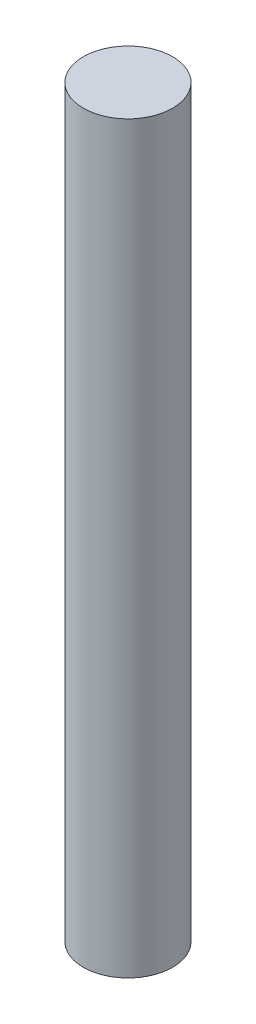
ISO-10303-21;
HEADER;
FILE_DESCRIPTION(('STEP AP214'),'2;1');
FILE_NAME('part.step','',(''),(''),'','','');
FILE_SCHEMA(('AUTOMOTIVE_DESIGN { 1 0 10303 214 1 1 1 1 }'));
ENDSEC;
DATA;
#1=APPLICATION_CONTEXT('core data for automotive mechanical design processes');
#2=APPLICATION_PROTOCOL_DEFINITION('international standard','automotive_design',2000,#1);
#3=PRODUCT_CONTEXT('',#1,'mechanical');
#4=PRODUCT('Part','Part','',(#3));
#5=PRODUCT_RELATED_PRODUCT_CATEGORY('part','',(#4));
#6=PRODUCT_DEFINITION_FORMATION('','',#4);
#7=PRODUCT_DEFINITION_CONTEXT('part definition',#1,'design');
#8=PRODUCT_DEFINITION('design','',#6,#7);
#9=PRODUCT_DEFINITION_SHAPE('','',#8);
#10=(LENGTH_UNIT() NAMED_UNIT(*) SI_UNIT(.MILLI.,.METRE.));
#11=(NAMED_UNIT(*) PLANE_ANGLE_UNIT() SI_UNIT($,.RADIAN.));
#12=(NAMED_UNIT(*) SI_UNIT($,.STERADIAN.) SOLID_ANGLE_UNIT());
#13=UNCERTAINTY_MEASURE_WITH_UNIT(LENGTH_MEASURE(1.E-05),#10,'distance_accuracy_value','');
#14=(GEOMETRIC_REPRESENTATION_CONTEXT(3) GLOBAL_UNCERTAINTY_ASSIGNED_CONTEXT((#13)) GLOBAL_UNIT_ASSIGNED_CONTEXT((#10,
#11,#12)) REPRESENTATION_CONTEXT('',''));
#15=CARTESIAN_POINT('',(0.,0.,0.));
#16=DIRECTION('',(0.,0.,1.));
#17=DIRECTION('',(1.,0.,0.));
#18=AXIS2_PLACEMENT_3D('',#15,#16,#17);
#19=CARTESIAN_POINT('',(0.,50.,0.));
#20=DIRECTION('',(0.,-1.,0.));
#21=DIRECTION('',(0.,0.,-1.));
#22=AXIS2_PLACEMENT_3D('',#19,#20,#21);
#23=CYLINDRICAL_SURFACE('',#22,3.);
#24=CARTESIAN_POINT('',(0.,50.,0.));
#25=DIRECTION('',(0.,1.,0.));
#26=DIRECTION('',(0.,0.,1.));
#27=AXIS2_PLACEMENT_3D('',#24,#25,#26);
#28=CIRCLE('',#27,3.);
#29=CARTESIAN_POINT('',(0.,50.,3.));
#30=VERTEX_POINT('',#29);
#31=EDGE_CURVE('E10',#30,#30,#28,.T.);
#32=ORIENTED_EDGE('',*,*,#31,.F.);
#33=EDGE_LOOP('',(#32));
#34=FACE_BOUND('',#33,.T.);
#35=CARTESIAN_POINT('',(0.,0.,0.));
#36=DIRECTION('',(0.,1.,0.));
#37=DIRECTION('',(0.,0.,1.));
#38=AXIS2_PLACEMENT_3D('',#35,#36,#37);
#39=CIRCLE('',#38,3.);
#40=CARTESIAN_POINT('',(0.,0.,3.));
#41=VERTEX_POINT('',#40);
#42=EDGE_CURVE('E48',#41,#41,#39,.T.);
#43=ORIENTED_EDGE('',*,*,#42,.T.);
#44=EDGE_LOOP('',(#43));
#45=FACE_BOUND('',#44,.T.);
#46=ADVANCED_FACE('F44',(#34,#45),#23,.T.);
#47=CARTESIAN_POINT('',(0.,50.,0.));
#48=DIRECTION('',(0.,1.,0.));
#49=DIRECTION('',(0.,0.,1.));
#50=AXIS2_PLACEMENT_3D('',#47,#48,#49);
#51=PLANE('',#50);
#52=ORIENTED_EDGE('',*,*,#31,.T.);
#53=EDGE_LOOP('',(#52));
#54=FACE_BOUND('',#53,.T.);
#55=ADVANCED_FACE('F58',(#54),#51,.T.);
#56=CARTESIAN_POINT('',(0.,0.,0.));
#57=DIRECTION('',(0.,1.,0.));
#58=DIRECTION('',(0.,0.,1.));
#59=AXIS2_PLACEMENT_3D('',#56,#57,#58);
#60=PLANE('',#59);
#61=ORIENTED_EDGE('',*,*,#42,.F.);
#62=EDGE_LOOP('',(#61));
#63=FACE_BOUND('',#62,.T.);
#64=ADVANCED_FACE('F59',(#63),#60,.F.);
#65=CLOSED_SHELL('',(#46,#55,#64));
#66=MANIFOLD_SOLID_BREP('B2',#65);
#67=ADVANCED_BREP_SHAPE_REPRESENTATION('',(#18,#66),#14);
#68=SHAPE_DEFINITION_REPRESENTATION(#9,#67);
ENDSEC;
END-ISO-10303-21;
